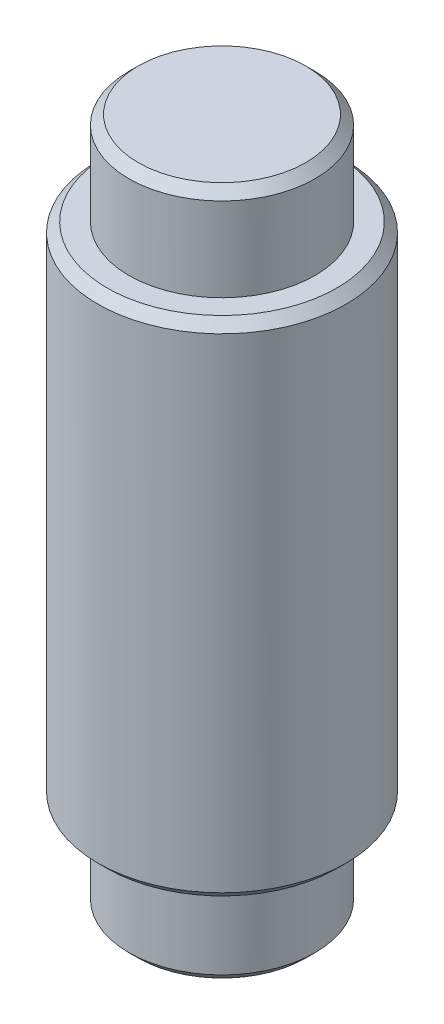
ISO-10303-21;
HEADER;
FILE_DESCRIPTION(('STEP AP214'),'2;1');
FILE_NAME('part.step','',(''),(''),'','','');
FILE_SCHEMA(('AUTOMOTIVE_DESIGN { 1 0 10303 214 1 1 1 1 }'));
ENDSEC;
DATA;
#1=APPLICATION_CONTEXT('core data for automotive mechanical design processes');
#2=APPLICATION_PROTOCOL_DEFINITION('international standard','automotive_design',2000,#1);
#3=PRODUCT_CONTEXT('',#1,'mechanical');
#4=PRODUCT('Part','Part','',(#3));
#5=PRODUCT_RELATED_PRODUCT_CATEGORY('part','',(#4));
#6=PRODUCT_DEFINITION_FORMATION('','',#4);
#7=PRODUCT_DEFINITION_CONTEXT('part definition',#1,'design');
#8=PRODUCT_DEFINITION('design','',#6,#7);
#9=PRODUCT_DEFINITION_SHAPE('','',#8);
#10=(LENGTH_UNIT() NAMED_UNIT(*) SI_UNIT(.MILLI.,.METRE.));
#11=(NAMED_UNIT(*) PLANE_ANGLE_UNIT() SI_UNIT($,.RADIAN.));
#12=(NAMED_UNIT(*) SI_UNIT($,.STERADIAN.) SOLID_ANGLE_UNIT());
#13=UNCERTAINTY_MEASURE_WITH_UNIT(LENGTH_MEASURE(1.E-05),#10,'distance_accuracy_value','');
#14=(GEOMETRIC_REPRESENTATION_CONTEXT(3) GLOBAL_UNCERTAINTY_ASSIGNED_CONTEXT((#13)) GLOBAL_UNIT_ASSIGNED_CONTEXT((#10,
#11,#12)) REPRESENTATION_CONTEXT('',''));
#15=CARTESIAN_POINT('',(0.,0.,0.));
#16=DIRECTION('',(0.,0.,1.));
#17=DIRECTION('',(1.,0.,0.));
#18=AXIS2_PLACEMENT_3D('',#15,#16,#17);
#19=CARTESIAN_POINT('',(-2.02279950000561,-14.8496605001343,21.064000107156));
#20=DIRECTION('',(0.,-1.,0.));
#21=DIRECTION('',(0.,0.,-1.));
#22=AXIS2_PLACEMENT_3D('',#19,#20,#21);
#23=PLANE('',#22);
#24=CARTESIAN_POINT('',(-2.02279950000562,-14.8496605000332,21.064000107156));
#25=DIRECTION('',(0.,1.,0.));
#26=DIRECTION('',(0.,0.,1.));
#27=AXIS2_PLACEMENT_3D('',#24,#25,#26);
#28=CIRCLE('',#27,1.35000000013571);
#29=CARTESIAN_POINT('',(-2.02279950000562,-14.8496605000332,22.4140001072917));
#30=VERTEX_POINT('',#29);
#31=EDGE_CURVE('E17',#30,#30,#28,.T.);
#32=ORIENTED_EDGE('',*,*,#31,.F.);
#33=EDGE_LOOP('',(#32));
#34=FACE_BOUND('',#33,.T.);
#35=ADVANCED_FACE('F14',(#34),#23,.T.);
#36=CARTESIAN_POINT('',(-2.02279950000586,-3.74966050013432,21.0640001071557));
#37=DIRECTION('',(0.,1.,0.));
#38=DIRECTION('',(0.,0.,1.));
#39=AXIS2_PLACEMENT_3D('',#36,#37,#38);
#40=PLANE('',#39);
#41=CARTESIAN_POINT('',(-2.02279950000586,-3.74966050009107,21.0640001071557));
#42=DIRECTION('',(0.,-1.,0.));
#43=DIRECTION('',(0.,0.,-1.));
#44=AXIS2_PLACEMENT_3D('',#41,#42,#43);
#45=CIRCLE('',#44,1.35000000002184);
#46=CARTESIAN_POINT('',(-2.02279950000586,-3.74966050009111,19.7140001071339));
#47=VERTEX_POINT('',#46);
#48=EDGE_CURVE('E42',#47,#47,#45,.T.);
#49=ORIENTED_EDGE('',*,*,#48,.F.);
#50=EDGE_LOOP('',(#49));
#51=FACE_BOUND('',#50,.T.);
#52=ADVANCED_FACE('F63',(#51),#40,.T.);
#53=CARTESIAN_POINT('',(-2.02279950000562,-14.6996605001277,21.064000107156));
#54=DIRECTION('',(0.,1.,0.));
#55=DIRECTION('',(0.,0.,1.));
#56=AXIS2_PLACEMENT_3D('',#53,#54,#55);
#57=CONICAL_SURFACE('',#56,1.50000000004124,0.785398163397425);
#58=CARTESIAN_POINT('',(-2.02279950000562,-14.6996605001343,21.0640001071559));
#59=DIRECTION('',(0.,-1.,0.));
#60=DIRECTION('',(0.,0.,-1.));
#61=AXIS2_PLACEMENT_3D('',#58,#59,#60);
#62=CIRCLE('',#61,1.5);
#63=CARTESIAN_POINT('',(-2.02279950000562,-14.6996605001344,19.5640001071559));
#64=VERTEX_POINT('',#63);
#65=EDGE_CURVE('E37',#64,#64,#62,.F.);
#66=ORIENTED_EDGE('',*,*,#65,.F.);
#67=EDGE_LOOP('',(#66));
#68=FACE_BOUND('',#67,.T.);
#69=ORIENTED_EDGE('',*,*,#31,.T.);
#70=EDGE_LOOP('',(#69));
#71=FACE_BOUND('',#70,.T.);
#72=ADVANCED_FACE('F60',(#68,#71),#57,.T.);
#73=CARTESIAN_POINT('',(-2.02279950000586,-3.89966050022391,21.0640001071557));
#74=DIRECTION('',(0.,-1.,0.));
#75=DIRECTION('',(0.,0.,-1.));
#76=AXIS2_PLACEMENT_3D('',#73,#74,#75);
#77=CONICAL_SURFACE('',#76,1.50000000009784,0.785398163207992);
#78=CARTESIAN_POINT('',(-2.02279950000585,-3.89966050013432,21.0640001071557));
#79=DIRECTION('',(0.,1.,0.));
#80=DIRECTION('',(0.,0.,1.));
#81=AXIS2_PLACEMENT_3D('',#78,#79,#80);
#82=CIRCLE('',#81,1.50000000000001);
#83=CARTESIAN_POINT('',(-2.02279950000585,-3.89966050013429,22.5640001071557));
#84=VERTEX_POINT('',#83);
#85=EDGE_CURVE('E33',#84,#84,#82,.F.);
#86=ORIENTED_EDGE('',*,*,#85,.F.);
#87=EDGE_LOOP('',(#86));
#88=FACE_BOUND('',#87,.T.);
#89=ORIENTED_EDGE('',*,*,#48,.T.);
#90=EDGE_LOOP('',(#89));
#91=FACE_BOUND('',#90,.T.);
#92=ADVANCED_FACE('F99',(#88,#91),#77,.T.);
#93=CARTESIAN_POINT('',(-2.02279950000563,-14.0996605001343,21.0640001071559));
#94=DIRECTION('',(0.,-1.,0.));
#95=DIRECTION('',(0.,0.,-1.));
#96=AXIS2_PLACEMENT_3D('',#93,#94,#95);
#97=CYLINDRICAL_SURFACE('',#96,1.5);
#98=CARTESIAN_POINT('',(-2.02279950000565,-13.3496605001343,21.0640001071559));
#99=DIRECTION('',(0.,-1.,0.));
#100=DIRECTION('',(0.,0.,-1.));
#101=AXIS2_PLACEMENT_3D('',#98,#99,#100);
#102=CIRCLE('',#101,1.5);
#103=CARTESIAN_POINT('',(-2.02279950000565,-13.3496605001344,19.5640001071559));
#104=VERTEX_POINT('',#103);
#105=EDGE_CURVE('E36',#104,#104,#102,.F.);
#106=ORIENTED_EDGE('',*,*,#105,.F.);
#107=EDGE_LOOP('',(#106));
#108=FACE_BOUND('',#107,.T.);
#109=ORIENTED_EDGE('',*,*,#65,.T.);
#110=EDGE_LOOP('',(#109));
#111=FACE_BOUND('',#110,.T.);
#112=ADVANCED_FACE('F95',(#108,#111),#97,.T.);
#113=CARTESIAN_POINT('',(-2.02279950000584,-4.49966050013432,21.0640001071557));
#114=DIRECTION('',(0.,1.,0.));
#115=DIRECTION('',(0.,0.,1.));
#116=AXIS2_PLACEMENT_3D('',#113,#114,#115);
#117=CYLINDRICAL_SURFACE('',#116,1.50000000000001);
#118=CARTESIAN_POINT('',(-2.02279950000582,-5.24966050013432,21.0640001071557));
#119=DIRECTION('',(0.,1.,0.));
#120=DIRECTION('',(0.,0.,1.));
#121=AXIS2_PLACEMENT_3D('',#118,#119,#120);
#122=CIRCLE('',#121,1.50000000000001);
#123=CARTESIAN_POINT('',(-2.02279950000582,-5.24966050013429,22.5640001071557));
#124=VERTEX_POINT('',#123);
#125=EDGE_CURVE('E50',#124,#124,#122,.F.);
#126=ORIENTED_EDGE('',*,*,#125,.F.);
#127=EDGE_LOOP('',(#126));
#128=FACE_BOUND('',#127,.T.);
#129=ORIENTED_EDGE('',*,*,#85,.T.);
#130=EDGE_LOOP('',(#129));
#131=FACE_BOUND('',#130,.T.);
#132=ADVANCED_FACE('F91',(#128,#131),#117,.T.);
#133=CARTESIAN_POINT('',(-2.02279950000565,-13.3496605001343,21.0640001071559));
#134=DIRECTION('',(0.,-1.,0.));
#135=DIRECTION('',(0.,0.,-1.));
#136=AXIS2_PLACEMENT_3D('',#133,#134,#135);
#137=PLANE('',#136);
#138=ORIENTED_EDGE('',*,*,#105,.T.);
#139=EDGE_LOOP('',(#138));
#140=FACE_BOUND('',#139,.T.);
#141=CARTESIAN_POINT('',(-2.02279950000565,-13.3496605001824,21.0640001071559));
#142=DIRECTION('',(0.,1.,0.));
#143=DIRECTION('',(0.,0.,1.));
#144=AXIS2_PLACEMENT_3D('',#141,#142,#143);
#145=CIRCLE('',#144,1.850000000067);
#146=CARTESIAN_POINT('',(-2.02279950000565,-13.3496605001823,22.9140001072229));
#147=VERTEX_POINT('',#146);
#148=EDGE_CURVE('E47',#147,#147,#145,.T.);
#149=ORIENTED_EDGE('',*,*,#148,.F.);
#150=EDGE_LOOP('',(#149));
#151=FACE_BOUND('',#150,.T.);
#152=ADVANCED_FACE('F87',(#140,#151),#137,.T.);
#153=CARTESIAN_POINT('',(-2.02279950000583,-5.24966050013432,21.0640001071557));
#154=DIRECTION('',(0.,1.,0.));
#155=DIRECTION('',(0.,0.,1.));
#156=AXIS2_PLACEMENT_3D('',#153,#154,#155);
#157=PLANE('',#156);
#158=ORIENTED_EDGE('',*,*,#125,.T.);
#159=EDGE_LOOP('',(#158));
#160=FACE_BOUND('',#159,.T.);
#161=CARTESIAN_POINT('',(-2.02279950000582,-5.24966050016928,21.0640001071557));
#162=DIRECTION('',(0.,-1.,0.));
#163=DIRECTION('',(0.,0.,-1.));
#164=AXIS2_PLACEMENT_3D('',#161,#162,#163);
#165=CIRCLE('',#164,1.84999999995322);
#166=CARTESIAN_POINT('',(-2.02279950000582,-5.24966050016934,19.2140001072025));
#167=VERTEX_POINT('',#166);
#168=EDGE_CURVE('E26',#167,#167,#165,.T.);
#169=ORIENTED_EDGE('',*,*,#168,.F.);
#170=EDGE_LOOP('',(#169));
#171=FACE_BOUND('',#170,.T.);
#172=ADVANCED_FACE('F83',(#160,#171),#157,.T.);
#173=CARTESIAN_POINT('',(-2.02279950000565,-13.1996605001631,21.0640001071559));
#174=DIRECTION('',(0.,1.,0.));
#175=DIRECTION('',(0.,0.,1.));
#176=AXIS2_PLACEMENT_3D('',#173,#174,#175);
#177=CONICAL_SURFACE('',#176,2.00000000002938,0.785398163207953);
#178=CARTESIAN_POINT('',(-2.02279950000565,-13.1996605001344,21.0640001071559));
#179=DIRECTION('',(0.,-1.,0.));
#180=DIRECTION('',(0.,0.,-1.));
#181=AXIS2_PLACEMENT_3D('',#178,#179,#180);
#182=CIRCLE('',#181,2.);
#183=CARTESIAN_POINT('',(-2.02279950000565,-13.1996605001344,19.0640001071559));
#184=VERTEX_POINT('',#183);
#185=EDGE_CURVE('E21',#184,#184,#182,.F.);
#186=ORIENTED_EDGE('',*,*,#185,.F.);
#187=EDGE_LOOP('',(#186));
#188=FACE_BOUND('',#187,.T.);
#189=ORIENTED_EDGE('',*,*,#148,.T.);
#190=EDGE_LOOP('',(#189));
#191=FACE_BOUND('',#190,.T.);
#192=ADVANCED_FACE('F76',(#188,#191),#177,.T.);
#193=CARTESIAN_POINT('',(-2.02279950000582,-5.39966050007474,21.0640001071557));
#194=DIRECTION('',(0.,-1.,0.));
#195=DIRECTION('',(0.,0.,-1.));
#196=AXIS2_PLACEMENT_3D('',#193,#194,#195);
#197=CONICAL_SURFACE('',#196,1.99999999980184,0.785398163207993);
#198=CARTESIAN_POINT('',(-2.02279950000583,-5.39966050013433,21.0640001071557));
#199=DIRECTION('',(0.,-1.,0.));
#200=DIRECTION('',(0.,0.,-1.));
#201=AXIS2_PLACEMENT_3D('',#198,#199,#200);
#202=CIRCLE('',#201,2.);
#203=CARTESIAN_POINT('',(-2.02279950000583,-5.39966050013437,19.0640001071557));
#204=VERTEX_POINT('',#203);
#205=EDGE_CURVE('E10',#204,#204,#202,.T.);
#206=ORIENTED_EDGE('',*,*,#205,.F.);
#207=EDGE_LOOP('',(#206));
#208=FACE_BOUND('',#207,.T.);
#209=ORIENTED_EDGE('',*,*,#168,.T.);
#210=EDGE_LOOP('',(#209));
#211=FACE_BOUND('',#210,.T.);
#212=ADVANCED_FACE('F71',(#208,#211),#197,.T.);
#213=CARTESIAN_POINT('',(-2.02279950000574,-9.29966050013432,21.0640001071558));
#214=DIRECTION('',(0.,-1.,0.));
#215=DIRECTION('',(0.,0.,-1.));
#216=AXIS2_PLACEMENT_3D('',#213,#214,#215);
#217=CYLINDRICAL_SURFACE('',#216,2.);
#218=ORIENTED_EDGE('',*,*,#205,.T.);
#219=EDGE_LOOP('',(#218));
#220=FACE_BOUND('',#219,.T.);
#221=ORIENTED_EDGE('',*,*,#185,.T.);
#222=EDGE_LOOP('',(#221));
#223=FACE_BOUND('',#222,.T.);
#224=ADVANCED_FACE('F69',(#220,#223),#217,.T.);
#225=CLOSED_SHELL('',(#35,#52,#72,#92,#112,#132,#152,#172,#192,#212,#224));
#226=MANIFOLD_SOLID_BREP('B1',#225);
#227=ADVANCED_BREP_SHAPE_REPRESENTATION('',(#18,#226),#14);
#228=SHAPE_DEFINITION_REPRESENTATION(#9,#227);
ENDSEC;
END-ISO-10303-21;
